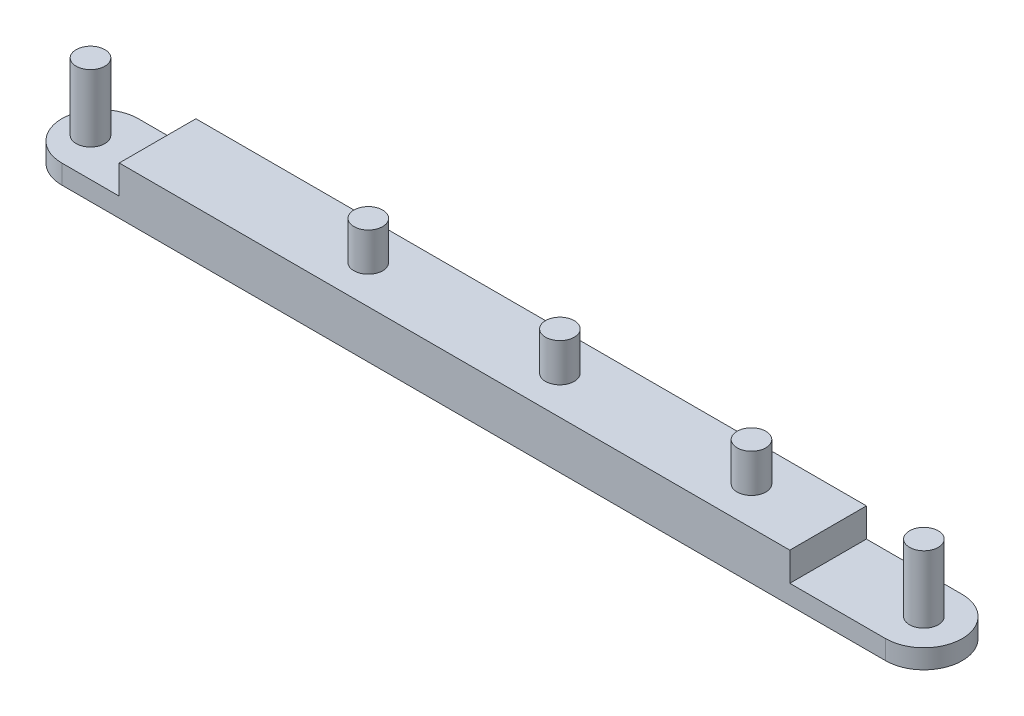
ISO-10303-21;
HEADER;
FILE_DESCRIPTION(('STEP AP214'),'2;1');
FILE_NAME('part.step','',(''),(''),'','','');
FILE_SCHEMA(('AUTOMOTIVE_DESIGN { 1 0 10303 214 1 1 1 1 }'));
ENDSEC;
DATA;
#1=APPLICATION_CONTEXT('core data for automotive mechanical design processes');
#2=APPLICATION_PROTOCOL_DEFINITION('international standard','automotive_design',2000,#1);
#3=PRODUCT_CONTEXT('',#1,'mechanical');
#4=PRODUCT('Part','Part','',(#3));
#5=PRODUCT_RELATED_PRODUCT_CATEGORY('part','',(#4));
#6=PRODUCT_DEFINITION_FORMATION('','',#4);
#7=PRODUCT_DEFINITION_CONTEXT('part definition',#1,'design');
#8=PRODUCT_DEFINITION('design','',#6,#7);
#9=PRODUCT_DEFINITION_SHAPE('','',#8);
#10=(LENGTH_UNIT() NAMED_UNIT(*) SI_UNIT(.MILLI.,.METRE.));
#11=(NAMED_UNIT(*) PLANE_ANGLE_UNIT() SI_UNIT($,.RADIAN.));
#12=(NAMED_UNIT(*) SI_UNIT($,.STERADIAN.) SOLID_ANGLE_UNIT());
#13=UNCERTAINTY_MEASURE_WITH_UNIT(LENGTH_MEASURE(1.E-05),#10,'distance_accuracy_value','');
#14=(GEOMETRIC_REPRESENTATION_CONTEXT(3) GLOBAL_UNCERTAINTY_ASSIGNED_CONTEXT((#13)) GLOBAL_UNIT_ASSIGNED_CONTEXT((#10,
#11,#12)) REPRESENTATION_CONTEXT('',''));
#15=CARTESIAN_POINT('',(0.,0.,0.));
#16=DIRECTION('',(0.,0.,1.));
#17=DIRECTION('',(1.,0.,0.));
#18=AXIS2_PLACEMENT_3D('',#15,#16,#17);
#19=CARTESIAN_POINT('',(0.,2.,0.));
#20=DIRECTION('',(0.,1.,0.));
#21=DIRECTION('',(0.,0.,1.));
#22=AXIS2_PLACEMENT_3D('',#19,#20,#21);
#23=PLANE('',#22);
#24=DIRECTION('',(-1.,0.,0.));
#25=VECTOR('',#24,1.);
#26=CARTESIAN_POINT('',(-25.,2.,-3.99999999999999));
#27=LINE('',#26,#25);
#28=CARTESIAN_POINT('',(-15.,2.,-3.99999999999999));
#29=VERTEX_POINT('',#28);
#30=CARTESIAN_POINT('',(-21.,2.,-3.99999999999999));
#31=VERTEX_POINT('',#30);
#32=EDGE_CURVE('E117',#29,#31,#27,.T.);
#33=ORIENTED_EDGE('',*,*,#32,.T.);
#34=CARTESIAN_POINT('',(-21.,2.,0.));
#35=DIRECTION('',(0.,1.,0.));
#36=DIRECTION('',(0.,0.,1.));
#37=AXIS2_PLACEMENT_3D('',#34,#35,#36);
#38=CIRCLE('',#37,4.);
#39=CARTESIAN_POINT('',(-25.,2.,0.));
#40=VERTEX_POINT('',#39);
#41=EDGE_CURVE('E44',#31,#40,#38,.T.);
#42=ORIENTED_EDGE('',*,*,#41,.T.);
#43=CARTESIAN_POINT('',(-21.,2.,0.));
#44=DIRECTION('',(0.,1.,0.));
#45=DIRECTION('',(0.,0.,1.));
#46=AXIS2_PLACEMENT_3D('',#43,#44,#45);
#47=CIRCLE('',#46,4.);
#48=CARTESIAN_POINT('',(-21.,2.,4.));
#49=VERTEX_POINT('',#48);
#50=EDGE_CURVE('E51',#40,#49,#47,.T.);
#51=ORIENTED_EDGE('',*,*,#50,.T.);
#52=DIRECTION('',(1.,0.,0.));
#53=VECTOR('',#52,1.);
#54=CARTESIAN_POINT('',(-25.,2.,4.));
#55=LINE('',#54,#53);
#56=CARTESIAN_POINT('',(-15.,2.,4.));
#57=VERTEX_POINT('',#56);
#58=EDGE_CURVE('E100',#49,#57,#55,.T.);
#59=ORIENTED_EDGE('',*,*,#58,.T.);
#60=DIRECTION('',(0.,0.,-1.));
#61=VECTOR('',#60,1.);
#62=CARTESIAN_POINT('',(-15.,2.,-3.99999999999999));
#63=LINE('',#62,#61);
#64=EDGE_CURVE('E103',#57,#29,#63,.T.);
#65=ORIENTED_EDGE('',*,*,#64,.T.);
#66=EDGE_LOOP('',(#33,#42,#51,#59,#65));
#67=FACE_BOUND('',#66,.T.);
#68=CARTESIAN_POINT('',(-22.,2.,0.));
#69=DIRECTION('',(0.,1.,0.));
#70=DIRECTION('',(0.,0.,1.));
#71=AXIS2_PLACEMENT_3D('',#68,#69,#70);
#72=CIRCLE('',#71,1.5);
#73=CARTESIAN_POINT('',(-22.,2.,1.5));
#74=VERTEX_POINT('',#73);
#75=EDGE_CURVE('E204',#74,#74,#72,.T.);
#76=ORIENTED_EDGE('',*,*,#75,.F.);
#77=EDGE_LOOP('',(#76));
#78=FACE_BOUND('',#77,.T.);
#79=ADVANCED_FACE('F35',(#67,#78),#23,.T.);
#80=CARTESIAN_POINT('',(0.,5.,0.));
#81=DIRECTION('',(0.,1.,0.));
#82=DIRECTION('',(0.,0.,1.));
#83=AXIS2_PLACEMENT_3D('',#80,#81,#82);
#84=PLANE('',#83);
#85=DIRECTION('',(0.,0.,-1.));
#86=VECTOR('',#85,1.);
#87=CARTESIAN_POINT('',(-15.,5.,-3.99999999999999));
#88=LINE('',#87,#86);
#89=CARTESIAN_POINT('',(-15.,5.,4.));
#90=VERTEX_POINT('',#89);
#91=CARTESIAN_POINT('',(-15.,5.,-3.99999999999999));
#92=VERTEX_POINT('',#91);
#93=EDGE_CURVE('E108',#90,#92,#88,.T.);
#94=ORIENTED_EDGE('',*,*,#93,.F.);
#95=DIRECTION('',(1.,0.,0.));
#96=VECTOR('',#95,1.);
#97=CARTESIAN_POINT('',(-25.,5.,4.));
#98=LINE('',#97,#96);
#99=CARTESIAN_POINT('',(55.,5.,4.));
#100=VERTEX_POINT('',#99);
#101=EDGE_CURVE('E122',#90,#100,#98,.T.);
#102=ORIENTED_EDGE('',*,*,#101,.T.);
#103=DIRECTION('',(0.,0.,-1.));
#104=VECTOR('',#103,1.);
#105=CARTESIAN_POINT('',(55.,5.,-3.99999999999999));
#106=LINE('',#105,#104);
#107=CARTESIAN_POINT('',(55.,5.,-3.99999999999999));
#108=VERTEX_POINT('',#107);
#109=EDGE_CURVE('E154',#100,#108,#106,.T.);
#110=ORIENTED_EDGE('',*,*,#109,.T.);
#111=DIRECTION('',(-1.,0.,0.));
#112=VECTOR('',#111,1.);
#113=CARTESIAN_POINT('',(-25.,5.,-3.99999999999999));
#114=LINE('',#113,#112);
#115=EDGE_CURVE('E156',#108,#92,#114,.T.);
#116=ORIENTED_EDGE('',*,*,#115,.T.);
#117=EDGE_LOOP('',(#94,#102,#110,#116));
#118=FACE_BOUND('',#117,.T.);
#119=CARTESIAN_POINT('',(27.,5.,1.43128700505679E-13));
#120=DIRECTION('',(0.,1.,0.));
#121=DIRECTION('',(0.,0.,1.));
#122=AXIS2_PLACEMENT_3D('',#119,#120,#121);
#123=CIRCLE('',#122,1.5);
#124=CARTESIAN_POINT('',(27.,5.,1.50000000000014));
#125=VERTEX_POINT('',#124);
#126=EDGE_CURVE('E132',#125,#125,#123,.T.);
#127=ORIENTED_EDGE('',*,*,#126,.F.);
#128=EDGE_LOOP('',(#127));
#129=FACE_BOUND('',#128,.T.);
#130=CARTESIAN_POINT('',(47.,5.,0.));
#131=DIRECTION('',(0.,1.,0.));
#132=DIRECTION('',(0.,0.,1.));
#133=AXIS2_PLACEMENT_3D('',#130,#131,#132);
#134=CIRCLE('',#133,1.5);
#135=CARTESIAN_POINT('',(47.,5.,1.50000000000001));
#136=VERTEX_POINT('',#135);
#137=EDGE_CURVE('E138',#136,#136,#134,.T.);
#138=ORIENTED_EDGE('',*,*,#137,.F.);
#139=EDGE_LOOP('',(#138));
#140=FACE_BOUND('',#139,.T.);
#141=CARTESIAN_POINT('',(7.00000000000001,5.,2.82787954059404E-13));
#142=DIRECTION('',(0.,1.,0.));
#143=DIRECTION('',(0.,0.,1.));
#144=AXIS2_PLACEMENT_3D('',#141,#142,#143);
#145=CIRCLE('',#144,1.5);
#146=CARTESIAN_POINT('',(7.00000000000001,5.,1.50000000000029));
#147=VERTEX_POINT('',#146);
#148=EDGE_CURVE('E124',#147,#147,#145,.T.);
#149=ORIENTED_EDGE('',*,*,#148,.F.);
#150=EDGE_LOOP('',(#149));
#151=FACE_BOUND('',#150,.T.);
#152=ADVANCED_FACE('F214',(#118,#129,#140,#151),#84,.T.);
#153=CARTESIAN_POINT('',(65.,2.,0.));
#154=DIRECTION('',(0.,1.,0.));
#155=DIRECTION('',(0.,0.,1.));
#156=AXIS2_PLACEMENT_3D('',#153,#154,#155);
#157=PLANE('',#156);
#158=DIRECTION('',(0.,0.,-1.));
#159=VECTOR('',#158,1.);
#160=CARTESIAN_POINT('',(55.,2.,-3.99999999999999));
#161=LINE('',#160,#159);
#162=CARTESIAN_POINT('',(55.,2.,4.));
#163=VERTEX_POINT('',#162);
#164=CARTESIAN_POINT('',(55.,2.,-3.99999999999999));
#165=VERTEX_POINT('',#164);
#166=EDGE_CURVE('E150',#163,#165,#161,.T.);
#167=ORIENTED_EDGE('',*,*,#166,.F.);
#168=DIRECTION('',(1.,0.,0.));
#169=VECTOR('',#168,1.);
#170=CARTESIAN_POINT('',(-25.,2.,4.));
#171=LINE('',#170,#169);
#172=CARTESIAN_POINT('',(65.,2.,4.));
#173=VERTEX_POINT('',#172);
#174=EDGE_CURVE('E226',#163,#173,#171,.T.);
#175=ORIENTED_EDGE('',*,*,#174,.T.);
#176=CARTESIAN_POINT('',(65.,2.,0.));
#177=DIRECTION('',(0.,1.,0.));
#178=DIRECTION('',(0.,0.,1.));
#179=AXIS2_PLACEMENT_3D('',#176,#177,#178);
#180=CIRCLE('',#179,4.);
#181=CARTESIAN_POINT('',(65.,2.,-4.));
#182=VERTEX_POINT('',#181);
#183=EDGE_CURVE('E224',#173,#182,#180,.T.);
#184=ORIENTED_EDGE('',*,*,#183,.T.);
#185=DIRECTION('',(-1.,0.,0.));
#186=VECTOR('',#185,1.);
#187=CARTESIAN_POINT('',(65.,2.,-4.));
#188=LINE('',#187,#186);
#189=EDGE_CURVE('E168',#182,#165,#188,.T.);
#190=ORIENTED_EDGE('',*,*,#189,.T.);
#191=EDGE_LOOP('',(#167,#175,#184,#190));
#192=FACE_BOUND('',#191,.T.);
#193=CARTESIAN_POINT('',(65.,2.,0.));
#194=DIRECTION('',(0.,1.,0.));
#195=DIRECTION('',(0.,0.,1.));
#196=AXIS2_PLACEMENT_3D('',#193,#194,#195);
#197=CIRCLE('',#196,1.5);
#198=CARTESIAN_POINT('',(65.,2.,1.5));
#199=VERTEX_POINT('',#198);
#200=EDGE_CURVE('E144',#199,#199,#197,.T.);
#201=ORIENTED_EDGE('',*,*,#200,.F.);
#202=EDGE_LOOP('',(#201));
#203=FACE_BOUND('',#202,.T.);
#204=ADVANCED_FACE('F257',(#192,#203),#157,.T.);
#205=CARTESIAN_POINT('',(-25.,2.,4.));
#206=DIRECTION('',(0.,0.,-1.));
#207=DIRECTION('',(-1.,0.,0.));
#208=AXIS2_PLACEMENT_3D('',#205,#206,#207);
#209=PLANE('',#208);
#210=ORIENTED_EDGE('',*,*,#58,.F.);
#211=DIRECTION('',(0.,-1.,0.));
#212=VECTOR('',#211,1.);
#213=CARTESIAN_POINT('',(-21.,2.,4.));
#214=LINE('',#213,#212);
#215=CARTESIAN_POINT('',(-21.,0.,4.));
#216=VERTEX_POINT('',#215);
#217=EDGE_CURVE('E11',#49,#216,#214,.T.);
#218=ORIENTED_EDGE('',*,*,#217,.T.);
#219=DIRECTION('',(1.,0.,0.));
#220=VECTOR('',#219,1.);
#221=CARTESIAN_POINT('',(-25.,0.,4.));
#222=LINE('',#221,#220);
#223=CARTESIAN_POINT('',(65.,0.,4.));
#224=VERTEX_POINT('',#223);
#225=EDGE_CURVE('E178',#216,#224,#222,.T.);
#226=ORIENTED_EDGE('',*,*,#225,.T.);
#227=DIRECTION('',(0.,-1.,0.));
#228=VECTOR('',#227,1.);
#229=CARTESIAN_POINT('',(65.,2.,4.));
#230=LINE('',#229,#228);
#231=EDGE_CURVE('E184',#173,#224,#230,.T.);
#232=ORIENTED_EDGE('',*,*,#231,.F.);
#233=ORIENTED_EDGE('',*,*,#174,.F.);
#234=DIRECTION('',(0.,-1.,0.));
#235=VECTOR('',#234,1.);
#236=CARTESIAN_POINT('',(55.,5.,4.));
#237=LINE('',#236,#235);
#238=EDGE_CURVE('E173',#100,#163,#237,.T.);
#239=ORIENTED_EDGE('',*,*,#238,.F.);
#240=ORIENTED_EDGE('',*,*,#101,.F.);
#241=DIRECTION('',(0.,1.,0.));
#242=VECTOR('',#241,1.);
#243=CARTESIAN_POINT('',(-15.,2.,4.));
#244=LINE('',#243,#242);
#245=EDGE_CURVE('E112',#57,#90,#244,.T.);
#246=ORIENTED_EDGE('',*,*,#245,.F.);
#247=EDGE_LOOP('',(#210,#218,#226,#232,#233,#239,#240,#246));
#248=FACE_BOUND('',#247,.T.);
#249=ADVANCED_FACE('F120',(#248),#209,.F.);
#250=CARTESIAN_POINT('',(65.,2.,0.));
#251=DIRECTION('',(0.,-1.,0.));
#252=DIRECTION('',(0.,0.,-1.));
#253=AXIS2_PLACEMENT_3D('',#250,#251,#252);
#254=CYLINDRICAL_SURFACE('',#253,4.);
#255=CARTESIAN_POINT('',(65.,0.,0.));
#256=DIRECTION('',(0.,1.,0.));
#257=DIRECTION('',(0.,0.,1.));
#258=AXIS2_PLACEMENT_3D('',#255,#256,#257);
#259=CIRCLE('',#258,4.);
#260=CARTESIAN_POINT('',(65.,0.,-4.));
#261=VERTEX_POINT('',#260);
#262=EDGE_CURVE('E231',#224,#261,#259,.T.);
#263=ORIENTED_EDGE('',*,*,#262,.T.);
#264=DIRECTION('',(0.,-1.,0.));
#265=VECTOR('',#264,1.);
#266=CARTESIAN_POINT('',(65.,2.,-4.));
#267=LINE('',#266,#265);
#268=EDGE_CURVE('E222',#182,#261,#267,.T.);
#269=ORIENTED_EDGE('',*,*,#268,.F.);
#270=ORIENTED_EDGE('',*,*,#183,.F.);
#271=ORIENTED_EDGE('',*,*,#231,.T.);
#272=EDGE_LOOP('',(#263,#269,#270,#271));
#273=FACE_BOUND('',#272,.T.);
#274=ADVANCED_FACE('F238',(#273),#254,.T.);
#275=CARTESIAN_POINT('',(65.,2.,-4.));
#276=DIRECTION('',(0.,0.,1.));
#277=DIRECTION('',(1.,0.,0.));
#278=AXIS2_PLACEMENT_3D('',#275,#276,#277);
#279=PLANE('',#278);
#280=DIRECTION('',(-1.,0.,0.));
#281=VECTOR('',#280,1.);
#282=CARTESIAN_POINT('',(65.,0.,-4.));
#283=LINE('',#282,#281);
#284=CARTESIAN_POINT('',(-21.,0.,-3.99999999999999));
#285=VERTEX_POINT('',#284);
#286=EDGE_CURVE('E196',#261,#285,#283,.T.);
#287=ORIENTED_EDGE('',*,*,#286,.T.);
#288=DIRECTION('',(0.,-1.,0.));
#289=VECTOR('',#288,1.);
#290=CARTESIAN_POINT('',(-21.,2.,-3.99999999999999));
#291=LINE('',#290,#289);
#292=EDGE_CURVE('E186',#285,#31,#291,.F.);
#293=ORIENTED_EDGE('',*,*,#292,.T.);
#294=ORIENTED_EDGE('',*,*,#32,.F.);
#295=DIRECTION('',(0.,1.,0.));
#296=VECTOR('',#295,1.);
#297=CARTESIAN_POINT('',(-15.,2.,-3.99999999999999));
#298=LINE('',#297,#296);
#299=EDGE_CURVE('E115',#29,#92,#298,.T.);
#300=ORIENTED_EDGE('',*,*,#299,.T.);
#301=ORIENTED_EDGE('',*,*,#115,.F.);
#302=DIRECTION('',(0.,-1.,0.));
#303=VECTOR('',#302,1.);
#304=CARTESIAN_POINT('',(55.,5.,-3.99999999999999));
#305=LINE('',#304,#303);
#306=EDGE_CURVE('E159',#108,#165,#305,.T.);
#307=ORIENTED_EDGE('',*,*,#306,.T.);
#308=ORIENTED_EDGE('',*,*,#189,.F.);
#309=ORIENTED_EDGE('',*,*,#268,.T.);
#310=EDGE_LOOP('',(#287,#293,#294,#300,#301,#307,#308,#309));
#311=FACE_BOUND('',#310,.T.);
#312=ADVANCED_FACE('F193',(#311),#279,.F.);
#313=CARTESIAN_POINT('',(65.,0.,0.));
#314=DIRECTION('',(0.,1.,0.));
#315=DIRECTION('',(0.,0.,1.));
#316=AXIS2_PLACEMENT_3D('',#313,#314,#315);
#317=PLANE('',#316);
#318=CARTESIAN_POINT('',(-21.,0.,0.));
#319=DIRECTION('',(0.,1.,0.));
#320=DIRECTION('',(0.,0.,1.));
#321=AXIS2_PLACEMENT_3D('',#318,#319,#320);
#322=CIRCLE('',#321,4.);
#323=CARTESIAN_POINT('',(-25.,0.,0.));
#324=VERTEX_POINT('',#323);
#325=EDGE_CURVE('E181',#216,#324,#322,.F.);
#326=ORIENTED_EDGE('',*,*,#325,.T.);
#327=CARTESIAN_POINT('',(-21.,0.,0.));
#328=DIRECTION('',(0.,1.,0.));
#329=DIRECTION('',(0.,0.,1.));
#330=AXIS2_PLACEMENT_3D('',#327,#328,#329);
#331=CIRCLE('',#330,4.);
#332=EDGE_CURVE('E183',#324,#285,#331,.F.);
#333=ORIENTED_EDGE('',*,*,#332,.T.);
#334=ORIENTED_EDGE('',*,*,#286,.F.);
#335=ORIENTED_EDGE('',*,*,#262,.F.);
#336=ORIENTED_EDGE('',*,*,#225,.F.);
#337=EDGE_LOOP('',(#326,#333,#334,#335,#336));
#338=FACE_BOUND('',#337,.T.);
#339=ADVANCED_FACE('F242',(#338),#317,.F.);
#340=CARTESIAN_POINT('',(55.,5.,-3.99999999999999));
#341=DIRECTION('',(-1.,0.,0.));
#342=DIRECTION('',(0.,0.,1.));
#343=AXIS2_PLACEMENT_3D('',#340,#341,#342);
#344=PLANE('',#343);
#345=ORIENTED_EDGE('',*,*,#166,.T.);
#346=ORIENTED_EDGE('',*,*,#306,.F.);
#347=ORIENTED_EDGE('',*,*,#109,.F.);
#348=ORIENTED_EDGE('',*,*,#238,.T.);
#349=EDGE_LOOP('',(#345,#346,#347,#348));
#350=FACE_BOUND('',#349,.T.);
#351=ADVANCED_FACE('F219',(#350),#344,.F.);
#352=CARTESIAN_POINT('',(65.,9.,0.));
#353=DIRECTION('',(0.,-1.,0.));
#354=DIRECTION('',(0.,0.,-1.));
#355=AXIS2_PLACEMENT_3D('',#352,#353,#354);
#356=CYLINDRICAL_SURFACE('',#355,1.5);
#357=CARTESIAN_POINT('',(65.,9.,0.));
#358=DIRECTION('',(0.,1.,0.));
#359=DIRECTION('',(0.,0.,1.));
#360=AXIS2_PLACEMENT_3D('',#357,#358,#359);
#361=CIRCLE('',#360,1.5);
#362=CARTESIAN_POINT('',(65.,9.,1.5));
#363=VERTEX_POINT('',#362);
#364=EDGE_CURVE('E147',#363,#363,#361,.T.);
#365=ORIENTED_EDGE('',*,*,#364,.F.);
#366=EDGE_LOOP('',(#365));
#367=FACE_BOUND('',#366,.T.);
#368=ORIENTED_EDGE('',*,*,#200,.T.);
#369=EDGE_LOOP('',(#368));
#370=FACE_BOUND('',#369,.T.);
#371=ADVANCED_FACE('F290',(#367,#370),#356,.T.);
#372=CARTESIAN_POINT('',(65.,9.,0.));
#373=DIRECTION('',(0.,1.,0.));
#374=DIRECTION('',(0.,0.,1.));
#375=AXIS2_PLACEMENT_3D('',#372,#373,#374);
#376=PLANE('',#375);
#377=ORIENTED_EDGE('',*,*,#364,.T.);
#378=EDGE_LOOP('',(#377));
#379=FACE_BOUND('',#378,.T.);
#380=ADVANCED_FACE('F286',(#379),#376,.T.);
#381=CARTESIAN_POINT('',(47.,9.,0.));
#382=DIRECTION('',(0.,-1.,0.));
#383=DIRECTION('',(0.,0.,-1.));
#384=AXIS2_PLACEMENT_3D('',#381,#382,#383);
#385=CYLINDRICAL_SURFACE('',#384,1.5);
#386=CARTESIAN_POINT('',(47.,9.,0.));
#387=DIRECTION('',(0.,1.,0.));
#388=DIRECTION('',(0.,0.,1.));
#389=AXIS2_PLACEMENT_3D('',#386,#387,#388);
#390=CIRCLE('',#389,1.5);
#391=CARTESIAN_POINT('',(47.,9.,1.50000000000001));
#392=VERTEX_POINT('',#391);
#393=EDGE_CURVE('E141',#392,#392,#390,.T.);
#394=ORIENTED_EDGE('',*,*,#393,.F.);
#395=EDGE_LOOP('',(#394));
#396=FACE_BOUND('',#395,.T.);
#397=ORIENTED_EDGE('',*,*,#137,.T.);
#398=EDGE_LOOP('',(#397));
#399=FACE_BOUND('',#398,.T.);
#400=ADVANCED_FACE('F282',(#396,#399),#385,.T.);
#401=CARTESIAN_POINT('',(47.,9.,0.));
#402=DIRECTION('',(0.,1.,0.));
#403=DIRECTION('',(0.,0.,1.));
#404=AXIS2_PLACEMENT_3D('',#401,#402,#403);
#405=PLANE('',#404);
#406=ORIENTED_EDGE('',*,*,#393,.T.);
#407=EDGE_LOOP('',(#406));
#408=FACE_BOUND('',#407,.T.);
#409=ADVANCED_FACE('F278',(#408),#405,.T.);
#410=CARTESIAN_POINT('',(27.,9.,1.43128700505679E-13));
#411=DIRECTION('',(0.,-1.,0.));
#412=DIRECTION('',(0.,0.,-1.));
#413=AXIS2_PLACEMENT_3D('',#410,#411,#412);
#414=CYLINDRICAL_SURFACE('',#413,1.5);
#415=CARTESIAN_POINT('',(27.,9.,1.43128700505679E-13));
#416=DIRECTION('',(0.,1.,0.));
#417=DIRECTION('',(0.,0.,1.));
#418=AXIS2_PLACEMENT_3D('',#415,#416,#417);
#419=CIRCLE('',#418,1.5);
#420=CARTESIAN_POINT('',(27.,9.,1.50000000000014));
#421=VERTEX_POINT('',#420);
#422=EDGE_CURVE('E135',#421,#421,#419,.T.);
#423=ORIENTED_EDGE('',*,*,#422,.F.);
#424=EDGE_LOOP('',(#423));
#425=FACE_BOUND('',#424,.T.);
#426=ORIENTED_EDGE('',*,*,#126,.T.);
#427=EDGE_LOOP('',(#426));
#428=FACE_BOUND('',#427,.T.);
#429=ADVANCED_FACE('F274',(#425,#428),#414,.T.);
#430=CARTESIAN_POINT('',(27.,9.,1.43128700505679E-13));
#431=DIRECTION('',(0.,1.,0.));
#432=DIRECTION('',(0.,0.,1.));
#433=AXIS2_PLACEMENT_3D('',#430,#431,#432);
#434=PLANE('',#433);
#435=ORIENTED_EDGE('',*,*,#422,.T.);
#436=EDGE_LOOP('',(#435));
#437=FACE_BOUND('',#436,.T.);
#438=ADVANCED_FACE('F270',(#437),#434,.T.);
#439=CARTESIAN_POINT('',(7.00000000000001,9.,2.82787954059404E-13));
#440=DIRECTION('',(0.,-1.,0.));
#441=DIRECTION('',(0.,0.,-1.));
#442=AXIS2_PLACEMENT_3D('',#439,#440,#441);
#443=CYLINDRICAL_SURFACE('',#442,1.5);
#444=CARTESIAN_POINT('',(7.00000000000001,9.,2.82787954059404E-13));
#445=DIRECTION('',(0.,1.,0.));
#446=DIRECTION('',(0.,0.,1.));
#447=AXIS2_PLACEMENT_3D('',#444,#445,#446);
#448=CIRCLE('',#447,1.5);
#449=CARTESIAN_POINT('',(7.00000000000001,9.,1.50000000000029));
#450=VERTEX_POINT('',#449);
#451=EDGE_CURVE('E129',#450,#450,#448,.T.);
#452=ORIENTED_EDGE('',*,*,#451,.F.);
#453=EDGE_LOOP('',(#452));
#454=FACE_BOUND('',#453,.T.);
#455=ORIENTED_EDGE('',*,*,#148,.T.);
#456=EDGE_LOOP('',(#455));
#457=FACE_BOUND('',#456,.T.);
#458=ADVANCED_FACE('F266',(#454,#457),#443,.T.);
#459=CARTESIAN_POINT('',(7.00000000000001,9.,2.82787954059404E-13));
#460=DIRECTION('',(0.,1.,0.));
#461=DIRECTION('',(0.,0.,1.));
#462=AXIS2_PLACEMENT_3D('',#459,#460,#461);
#463=PLANE('',#462);
#464=ORIENTED_EDGE('',*,*,#451,.T.);
#465=EDGE_LOOP('',(#464));
#466=FACE_BOUND('',#465,.T.);
#467=ADVANCED_FACE('F263',(#466),#463,.T.);
#468=CARTESIAN_POINT('',(-15.,2.,-3.99999999999999));
#469=DIRECTION('',(1.,0.,0.));
#470=DIRECTION('',(0.,0.,-1.));
#471=AXIS2_PLACEMENT_3D('',#468,#469,#470);
#472=PLANE('',#471);
#473=ORIENTED_EDGE('',*,*,#93,.T.);
#474=ORIENTED_EDGE('',*,*,#299,.F.);
#475=ORIENTED_EDGE('',*,*,#64,.F.);
#476=ORIENTED_EDGE('',*,*,#245,.T.);
#477=EDGE_LOOP('',(#473,#474,#475,#476));
#478=FACE_BOUND('',#477,.T.);
#479=ADVANCED_FACE('F111',(#478),#472,.F.);
#480=CARTESIAN_POINT('',(-22.,9.,0.));
#481=DIRECTION('',(0.,-1.,0.));
#482=DIRECTION('',(0.,0.,-1.));
#483=AXIS2_PLACEMENT_3D('',#480,#481,#482);
#484=CYLINDRICAL_SURFACE('',#483,1.5);
#485=CARTESIAN_POINT('',(-22.,9.,0.));
#486=DIRECTION('',(0.,1.,0.));
#487=DIRECTION('',(0.,0.,1.));
#488=AXIS2_PLACEMENT_3D('',#485,#486,#487);
#489=CIRCLE('',#488,1.5);
#490=CARTESIAN_POINT('',(-22.,9.,1.5));
#491=VERTEX_POINT('',#490);
#492=EDGE_CURVE('E206',#491,#491,#489,.T.);
#493=ORIENTED_EDGE('',*,*,#492,.F.);
#494=EDGE_LOOP('',(#493));
#495=FACE_BOUND('',#494,.T.);
#496=ORIENTED_EDGE('',*,*,#75,.T.);
#497=EDGE_LOOP('',(#496));
#498=FACE_BOUND('',#497,.T.);
#499=ADVANCED_FACE('F249',(#495,#498),#484,.T.);
#500=CARTESIAN_POINT('',(-22.,9.,0.));
#501=DIRECTION('',(0.,1.,0.));
#502=DIRECTION('',(0.,0.,1.));
#503=AXIS2_PLACEMENT_3D('',#500,#501,#502);
#504=PLANE('',#503);
#505=ORIENTED_EDGE('',*,*,#492,.T.);
#506=EDGE_LOOP('',(#505));
#507=FACE_BOUND('',#506,.T.);
#508=ADVANCED_FACE('F244',(#507),#504,.T.);
#509=CARTESIAN_POINT('',(-21.,2.,0.));
#510=DIRECTION('',(0.,-1.,0.));
#511=DIRECTION('',(0.,0.,-1.));
#512=AXIS2_PLACEMENT_3D('',#509,#510,#511);
#513=CYLINDRICAL_SURFACE('',#512,4.);
#514=ORIENTED_EDGE('',*,*,#217,.F.);
#515=ORIENTED_EDGE('',*,*,#50,.F.);
#516=DIRECTION('',(0.,-1.,0.));
#517=VECTOR('',#516,1.);
#518=CARTESIAN_POINT('',(-25.,2.,0.));
#519=LINE('',#518,#517);
#520=EDGE_CURVE('E39',#324,#40,#519,.F.);
#521=ORIENTED_EDGE('',*,*,#520,.F.);
#522=ORIENTED_EDGE('',*,*,#325,.F.);
#523=EDGE_LOOP('',(#514,#515,#521,#522));
#524=FACE_BOUND('',#523,.T.);
#525=ADVANCED_FACE('F37',(#524),#513,.T.);
#526=CARTESIAN_POINT('',(-21.,2.,0.));
#527=DIRECTION('',(0.,-1.,0.));
#528=DIRECTION('',(0.,0.,-1.));
#529=AXIS2_PLACEMENT_3D('',#526,#527,#528);
#530=CYLINDRICAL_SURFACE('',#529,4.);
#531=ORIENTED_EDGE('',*,*,#41,.F.);
#532=ORIENTED_EDGE('',*,*,#292,.F.);
#533=ORIENTED_EDGE('',*,*,#332,.F.);
#534=ORIENTED_EDGE('',*,*,#520,.T.);
#535=EDGE_LOOP('',(#531,#532,#533,#534));
#536=FACE_BOUND('',#535,.T.);
#537=ADVANCED_FACE('F199',(#536),#530,.T.);
#538=CLOSED_SHELL('',(#79,#152,#204,#249,#274,#312,#339,#351,#371,#380,#400,#409,#429,#438,#458,
#467,#479,#499,#508,#525,#537));
#539=MANIFOLD_SOLID_BREP('B2',#538);
#540=ADVANCED_BREP_SHAPE_REPRESENTATION('',(#18,#539),#14);
#541=SHAPE_DEFINITION_REPRESENTATION(#9,#540);
ENDSEC;
END-ISO-10303-21;
